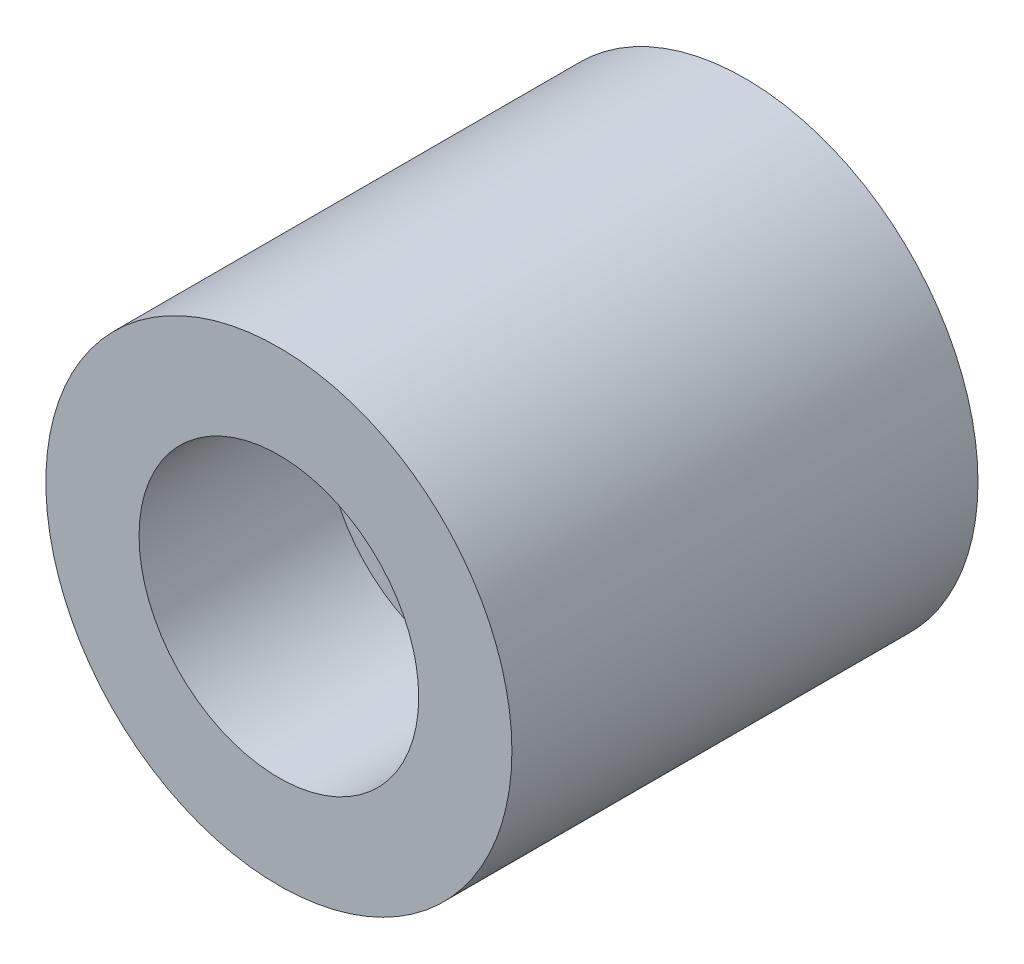
ISO-10303-21;
HEADER;
FILE_DESCRIPTION(('STEP AP214'),'2;1');
FILE_NAME('part.step','',(''),(''),'','','');
FILE_SCHEMA(('AUTOMOTIVE_DESIGN { 1 0 10303 214 1 1 1 1 }'));
ENDSEC;
DATA;
#1=APPLICATION_CONTEXT('core data for automotive mechanical design processes');
#2=APPLICATION_PROTOCOL_DEFINITION('international standard','automotive_design',2000,#1);
#3=PRODUCT_CONTEXT('',#1,'mechanical');
#4=PRODUCT('Part','Part','',(#3));
#5=PRODUCT_RELATED_PRODUCT_CATEGORY('part','',(#4));
#6=PRODUCT_DEFINITION_FORMATION('','',#4);
#7=PRODUCT_DEFINITION_CONTEXT('part definition',#1,'design');
#8=PRODUCT_DEFINITION('design','',#6,#7);
#9=PRODUCT_DEFINITION_SHAPE('','',#8);
#10=(LENGTH_UNIT() NAMED_UNIT(*) SI_UNIT(.MILLI.,.METRE.));
#11=(NAMED_UNIT(*) PLANE_ANGLE_UNIT() SI_UNIT($,.RADIAN.));
#12=(NAMED_UNIT(*) SI_UNIT($,.STERADIAN.) SOLID_ANGLE_UNIT());
#13=UNCERTAINTY_MEASURE_WITH_UNIT(LENGTH_MEASURE(1.E-05),#10,'distance_accuracy_value','');
#14=(GEOMETRIC_REPRESENTATION_CONTEXT(3) GLOBAL_UNCERTAINTY_ASSIGNED_CONTEXT((#13)) GLOBAL_UNIT_ASSIGNED_CONTEXT((#10,
#11,#12)) REPRESENTATION_CONTEXT('',''));
#15=CARTESIAN_POINT('',(0.,0.,0.));
#16=DIRECTION('',(0.,0.,1.));
#17=DIRECTION('',(1.,0.,0.));
#18=AXIS2_PLACEMENT_3D('',#15,#16,#17);
#19=CARTESIAN_POINT('',(0.,0.,0.));
#20=DIRECTION('',(0.,0.,1.));
#21=DIRECTION('',(1.,0.,0.));
#22=AXIS2_PLACEMENT_3D('',#19,#20,#21);
#23=CYLINDRICAL_SURFACE('',#22,3.);
#24=CARTESIAN_POINT('',(0.,0.,0.));
#25=DIRECTION('',(0.,0.,1.));
#26=DIRECTION('',(1.,0.,0.));
#27=AXIS2_PLACEMENT_3D('',#24,#25,#26);
#28=CIRCLE('',#27,3.);
#29=CARTESIAN_POINT('',(3.,0.,0.));
#30=VERTEX_POINT('',#29);
#31=EDGE_CURVE('E54',#30,#30,#28,.T.);
#32=ORIENTED_EDGE('',*,*,#31,.F.);
#33=EDGE_LOOP('',(#32));
#34=FACE_BOUND('',#33,.T.);
#35=CARTESIAN_POINT('',(0.,0.,12.));
#36=DIRECTION('',(0.,0.,1.));
#37=DIRECTION('',(1.,0.,0.));
#38=AXIS2_PLACEMENT_3D('',#35,#36,#37);
#39=CIRCLE('',#38,3.);
#40=CARTESIAN_POINT('',(3.,0.,12.));
#41=VERTEX_POINT('',#40);
#42=EDGE_CURVE('E45',#41,#41,#39,.F.);
#43=ORIENTED_EDGE('',*,*,#42,.F.);
#44=EDGE_LOOP('',(#43));
#45=FACE_BOUND('',#44,.T.);
#46=ADVANCED_FACE('F41',(#34,#45),#23,.F.);
#47=CARTESIAN_POINT('',(0.,0.,20.));
#48=DIRECTION('',(0.,0.,-1.));
#49=DIRECTION('',(-1.,0.,0.));
#50=AXIS2_PLACEMENT_3D('',#47,#48,#49);
#51=CYLINDRICAL_SURFACE('',#50,10.);
#52=CARTESIAN_POINT('',(0.,0.,20.));
#53=DIRECTION('',(0.,0.,1.));
#54=DIRECTION('',(1.,0.,0.));
#55=AXIS2_PLACEMENT_3D('',#52,#53,#54);
#56=CIRCLE('',#55,10.);
#57=CARTESIAN_POINT('',(10.,0.,20.));
#58=VERTEX_POINT('',#57);
#59=EDGE_CURVE('E10',#58,#58,#56,.T.);
#60=ORIENTED_EDGE('',*,*,#59,.F.);
#61=EDGE_LOOP('',(#60));
#62=FACE_BOUND('',#61,.T.);
#63=CARTESIAN_POINT('',(0.,0.,0.));
#64=DIRECTION('',(0.,0.,1.));
#65=DIRECTION('',(1.,0.,0.));
#66=AXIS2_PLACEMENT_3D('',#63,#64,#65);
#67=CIRCLE('',#66,10.);
#68=CARTESIAN_POINT('',(10.,0.,0.));
#69=VERTEX_POINT('',#68);
#70=EDGE_CURVE('E49',#69,#69,#67,.T.);
#71=ORIENTED_EDGE('',*,*,#70,.T.);
#72=EDGE_LOOP('',(#71));
#73=FACE_BOUND('',#72,.T.);
#74=ADVANCED_FACE('F43',(#62,#73),#51,.T.);
#75=CARTESIAN_POINT('',(0.,0.,20.));
#76=DIRECTION('',(0.,0.,1.));
#77=DIRECTION('',(1.,0.,0.));
#78=AXIS2_PLACEMENT_3D('',#75,#76,#77);
#79=PLANE('',#78);
#80=CARTESIAN_POINT('',(0.,0.,20.));
#81=DIRECTION('',(0.,0.,1.));
#82=DIRECTION('',(1.,0.,0.));
#83=AXIS2_PLACEMENT_3D('',#80,#81,#82);
#84=CIRCLE('',#83,6.);
#85=CARTESIAN_POINT('',(6.,0.,20.));
#86=VERTEX_POINT('',#85);
#87=EDGE_CURVE('E58',#86,#86,#84,.T.);
#88=ORIENTED_EDGE('',*,*,#87,.F.);
#89=EDGE_LOOP('',(#88));
#90=FACE_BOUND('',#89,.T.);
#91=ORIENTED_EDGE('',*,*,#59,.T.);
#92=EDGE_LOOP('',(#91));
#93=FACE_BOUND('',#92,.T.);
#94=ADVANCED_FACE('F78',(#90,#93),#79,.T.);
#95=CARTESIAN_POINT('',(0.,0.,0.));
#96=DIRECTION('',(0.,0.,1.));
#97=DIRECTION('',(1.,0.,0.));
#98=AXIS2_PLACEMENT_3D('',#95,#96,#97);
#99=PLANE('',#98);
#100=ORIENTED_EDGE('',*,*,#31,.T.);
#101=EDGE_LOOP('',(#100));
#102=FACE_BOUND('',#101,.T.);
#103=ORIENTED_EDGE('',*,*,#70,.F.);
#104=EDGE_LOOP('',(#103));
#105=FACE_BOUND('',#104,.T.);
#106=ADVANCED_FACE('F85',(#102,#105),#99,.F.);
#107=CARTESIAN_POINT('',(0.,0.,12.));
#108=DIRECTION('',(0.,0.,1.));
#109=DIRECTION('',(1.,0.,0.));
#110=AXIS2_PLACEMENT_3D('',#107,#108,#109);
#111=PLANE('',#110);
#112=CARTESIAN_POINT('',(0.,0.,12.));
#113=DIRECTION('',(0.,0.,1.));
#114=DIRECTION('',(1.,0.,0.));
#115=AXIS2_PLACEMENT_3D('',#112,#113,#114);
#116=CIRCLE('',#115,6.);
#117=CARTESIAN_POINT('',(6.,0.,12.));
#118=VERTEX_POINT('',#117);
#119=EDGE_CURVE('E61',#118,#118,#116,.T.);
#120=ORIENTED_EDGE('',*,*,#119,.T.);
#121=EDGE_LOOP('',(#120));
#122=FACE_BOUND('',#121,.T.);
#123=ORIENTED_EDGE('',*,*,#42,.T.);
#124=EDGE_LOOP('',(#123));
#125=FACE_BOUND('',#124,.T.);
#126=ADVANCED_FACE('F68',(#122,#125),#111,.T.);
#127=CARTESIAN_POINT('',(0.,0.,12.));
#128=DIRECTION('',(0.,0.,1.));
#129=DIRECTION('',(1.,0.,0.));
#130=AXIS2_PLACEMENT_3D('',#127,#128,#129);
#131=CYLINDRICAL_SURFACE('',#130,6.);
#132=ORIENTED_EDGE('',*,*,#119,.F.);
#133=EDGE_LOOP('',(#132));
#134=FACE_BOUND('',#133,.T.);
#135=ORIENTED_EDGE('',*,*,#87,.T.);
#136=EDGE_LOOP('',(#135));
#137=FACE_BOUND('',#136,.T.);
#138=ADVANCED_FACE('F83',(#134,#137),#131,.F.);
#139=CLOSED_SHELL('',(#46,#74,#94,#106,#126,#138));
#140=MANIFOLD_SOLID_BREP('B2',#139);
#141=ADVANCED_BREP_SHAPE_REPRESENTATION('',(#18,#140),#14);
#142=SHAPE_DEFINITION_REPRESENTATION(#9,#141);
ENDSEC;
END-ISO-10303-21;
